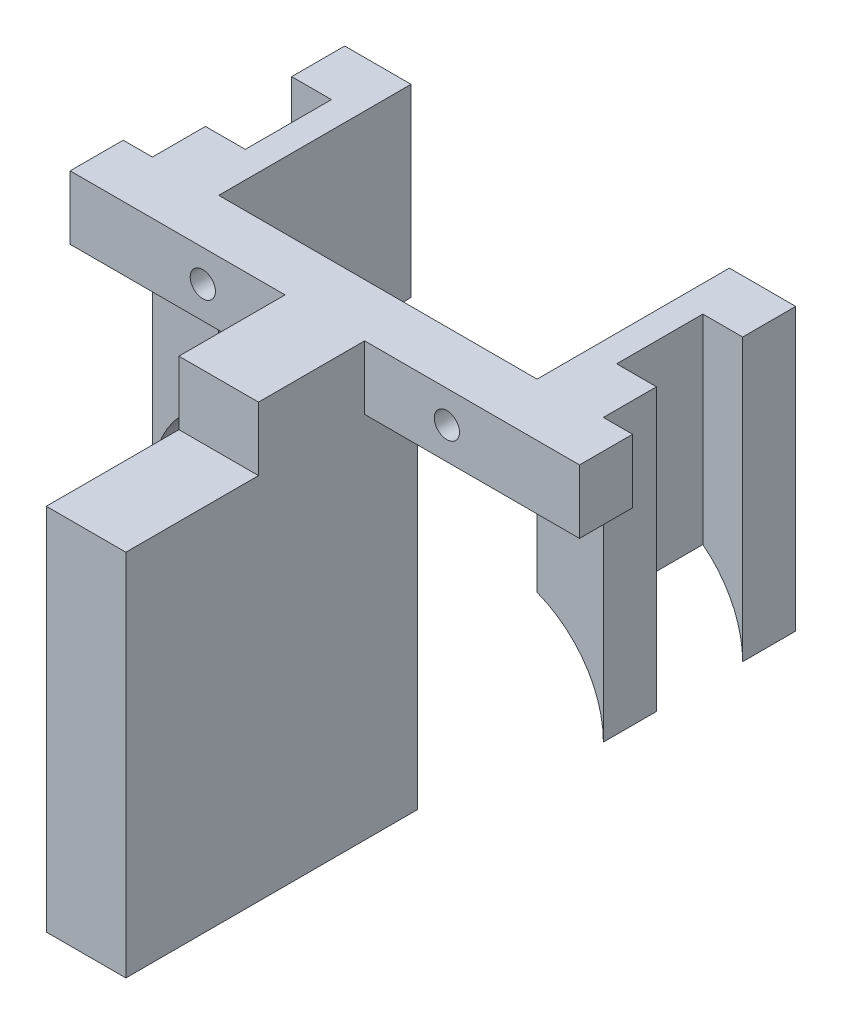
ISO-10303-21;
HEADER;
FILE_DESCRIPTION(('STEP AP214'),'2;1');
FILE_NAME('part.step','',(''),(''),'','','');
FILE_SCHEMA(('AUTOMOTIVE_DESIGN { 1 0 10303 214 1 1 1 1 }'));
ENDSEC;
DATA;
#1=APPLICATION_CONTEXT('core data for automotive mechanical design processes');
#2=APPLICATION_PROTOCOL_DEFINITION('international standard','automotive_design',2000,#1);
#3=PRODUCT_CONTEXT('',#1,'mechanical');
#4=PRODUCT('Part','Part','',(#3));
#5=PRODUCT_RELATED_PRODUCT_CATEGORY('part','',(#4));
#6=PRODUCT_DEFINITION_FORMATION('','',#4);
#7=PRODUCT_DEFINITION_CONTEXT('part definition',#1,'design');
#8=PRODUCT_DEFINITION('design','',#6,#7);
#9=PRODUCT_DEFINITION_SHAPE('','',#8);
#10=(LENGTH_UNIT() NAMED_UNIT(*) SI_UNIT(.MILLI.,.METRE.));
#11=(NAMED_UNIT(*) PLANE_ANGLE_UNIT() SI_UNIT($,.RADIAN.));
#12=(NAMED_UNIT(*) SI_UNIT($,.STERADIAN.) SOLID_ANGLE_UNIT());
#13=UNCERTAINTY_MEASURE_WITH_UNIT(LENGTH_MEASURE(1.E-05),#10,'distance_accuracy_value','');
#14=(GEOMETRIC_REPRESENTATION_CONTEXT(3) GLOBAL_UNCERTAINTY_ASSIGNED_CONTEXT((#13)) GLOBAL_UNIT_ASSIGNED_CONTEXT((#10,
#11,#12)) REPRESENTATION_CONTEXT('',''));
#15=CARTESIAN_POINT('',(0.,0.,0.));
#16=DIRECTION('',(0.,0.,1.));
#17=DIRECTION('',(1.,0.,0.));
#18=AXIS2_PLACEMENT_3D('',#15,#16,#17);
#19=CARTESIAN_POINT('',(0.,-4.8,4.));
#20=DIRECTION('',(0.,1.,0.));
#21=DIRECTION('',(0.,0.,1.));
#22=AXIS2_PLACEMENT_3D('',#19,#20,#21);
#23=PLANE('',#22);
#24=DIRECTION('',(0.,0.,-1.));
#25=VECTOR('',#24,1.);
#26=CARTESIAN_POINT('',(16.2,-4.8,0.));
#27=LINE('',#26,#25);
#28=CARTESIAN_POINT('',(16.2,-4.8,4.));
#29=VERTEX_POINT('',#28);
#30=CARTESIAN_POINT('',(16.2,-4.8,0.));
#31=VERTEX_POINT('',#30);
#32=EDGE_CURVE('E268',#29,#31,#27,.T.);
#33=ORIENTED_EDGE('',*,*,#32,.F.);
#34=DIRECTION('',(1.,0.,0.));
#35=VECTOR('',#34,1.);
#36=CARTESIAN_POINT('',(0.,-4.8,4.));
#37=LINE('',#36,#35);
#38=CARTESIAN_POINT('',(0.,-4.8,4.));
#39=VERTEX_POINT('',#38);
#40=EDGE_CURVE('E429',#39,#29,#37,.T.);
#41=ORIENTED_EDGE('',*,*,#40,.F.);
#42=DIRECTION('',(0.,0.,-1.));
#43=VECTOR('',#42,1.);
#44=CARTESIAN_POINT('',(0.,-4.8,4.));
#45=LINE('',#44,#43);
#46=CARTESIAN_POINT('',(0.,-4.8,0.));
#47=VERTEX_POINT('',#46);
#48=EDGE_CURVE('E45',#39,#47,#45,.T.);
#49=ORIENTED_EDGE('',*,*,#48,.T.);
#50=DIRECTION('',(1.,0.,0.));
#51=VECTOR('',#50,1.);
#52=CARTESIAN_POINT('',(0.,-4.8,0.));
#53=LINE('',#52,#51);
#54=CARTESIAN_POINT('',(2.2,-4.8,0.));
#55=VERTEX_POINT('',#54);
#56=EDGE_CURVE('E439',#47,#55,#53,.T.);
#57=ORIENTED_EDGE('',*,*,#56,.T.);
#58=CARTESIAN_POINT('',(7.2,-4.8,0.));
#59=VERTEX_POINT('',#58);
#60=EDGE_CURVE('E443',#55,#59,#53,.T.);
#61=ORIENTED_EDGE('',*,*,#60,.T.);
#62=EDGE_CURVE('E466',#59,#31,#53,.T.);
#63=ORIENTED_EDGE('',*,*,#62,.T.);
#64=EDGE_LOOP('',(#33,#41,#49,#57,#61,#63));
#65=FACE_BOUND('',#64,.T.);
#66=ADVANCED_FACE('F41',(#65),#23,.F.);
#67=DIRECTION('',(0.,0.,1.));
#68=VECTOR('',#67,1.);
#69=CARTESIAN_POINT('',(22.2,-4.8,0.));
#70=LINE('',#69,#68);
#71=CARTESIAN_POINT('',(22.2,-4.8,0.));
#72=VERTEX_POINT('',#71);
#73=CARTESIAN_POINT('',(22.2,-4.8,4.));
#74=VERTEX_POINT('',#73);
#75=EDGE_CURVE('E507',#72,#74,#70,.T.);
#76=ORIENTED_EDGE('',*,*,#75,.F.);
#77=CARTESIAN_POINT('',(31.2,-4.8,0.));
#78=VERTEX_POINT('',#77);
#79=EDGE_CURVE('E444',#72,#78,#53,.T.);
#80=ORIENTED_EDGE('',*,*,#79,.T.);
#81=DIRECTION('',(1.,0.,0.));
#82=VECTOR('',#81,1.);
#83=CARTESIAN_POINT('',(0.,-4.8,0.));
#84=LINE('',#83,#82);
#85=CARTESIAN_POINT('',(36.2,-4.8,0.));
#86=VERTEX_POINT('',#85);
#87=EDGE_CURVE('E362',#78,#86,#84,.T.);
#88=ORIENTED_EDGE('',*,*,#87,.T.);
#89=CARTESIAN_POINT('',(38.4,-4.8,0.));
#90=VERTEX_POINT('',#89);
#91=EDGE_CURVE('E438',#86,#90,#53,.T.);
#92=ORIENTED_EDGE('',*,*,#91,.T.);
#93=DIRECTION('',(0.,0.,-1.));
#94=VECTOR('',#93,1.);
#95=CARTESIAN_POINT('',(38.4,-4.8,4.));
#96=LINE('',#95,#94);
#97=CARTESIAN_POINT('',(38.4,-4.8,4.));
#98=VERTEX_POINT('',#97);
#99=EDGE_CURVE('E454',#98,#90,#96,.T.);
#100=ORIENTED_EDGE('',*,*,#99,.F.);
#101=EDGE_CURVE('E427',#74,#98,#37,.T.);
#102=ORIENTED_EDGE('',*,*,#101,.F.);
#103=EDGE_LOOP('',(#76,#80,#88,#92,#100,#102));
#104=FACE_BOUND('',#103,.T.);
#105=ADVANCED_FACE('F493',(#104),#23,.F.);
#106=CARTESIAN_POINT('',(0.,0.,4.));
#107=DIRECTION('',(0.,0.,1.));
#108=DIRECTION('',(1.,0.,0.));
#109=AXIS2_PLACEMENT_3D('',#106,#107,#108);
#110=PLANE('',#109);
#111=DIRECTION('',(0.,1.,0.));
#112=VECTOR('',#111,1.);
#113=CARTESIAN_POINT('',(22.2,0.,4.));
#114=LINE('',#113,#112);
#115=CARTESIAN_POINT('',(22.2,0.,4.));
#116=VERTEX_POINT('',#115);
#117=EDGE_CURVE('E269',#74,#116,#114,.T.);
#118=ORIENTED_EDGE('',*,*,#117,.F.);
#119=ORIENTED_EDGE('',*,*,#101,.T.);
#120=DIRECTION('',(0.,1.,0.));
#121=VECTOR('',#120,1.);
#122=CARTESIAN_POINT('',(38.4,0.,4.));
#123=LINE('',#122,#121);
#124=CARTESIAN_POINT('',(38.4,0.,4.));
#125=VERTEX_POINT('',#124);
#126=EDGE_CURVE('E431',#98,#125,#123,.T.);
#127=ORIENTED_EDGE('',*,*,#126,.T.);
#128=DIRECTION('',(-1.,0.,0.));
#129=VECTOR('',#128,1.);
#130=CARTESIAN_POINT('',(0.,0.,4.));
#131=LINE('',#130,#129);
#132=EDGE_CURVE('E67',#125,#116,#131,.T.);
#133=ORIENTED_EDGE('',*,*,#132,.T.);
#134=EDGE_LOOP('',(#118,#119,#127,#133));
#135=FACE_BOUND('',#134,.T.);
#136=CARTESIAN_POINT('',(28.4,-2.4,4.));
#137=DIRECTION('',(0.,0.,1.));
#138=DIRECTION('',(1.,0.,0.));
#139=AXIS2_PLACEMENT_3D('',#136,#137,#138);
#140=CIRCLE('',#139,0.950000000000001);
#141=CARTESIAN_POINT('',(29.35,-2.4,4.));
#142=VERTEX_POINT('',#141);
#143=EDGE_CURVE('E412',#142,#142,#140,.T.);
#144=ORIENTED_EDGE('',*,*,#143,.F.);
#145=EDGE_LOOP('',(#144));
#146=FACE_BOUND('',#145,.T.);
#147=ADVANCED_FACE('F508',(#135,#146),#110,.T.);
#148=CARTESIAN_POINT('',(0.,0.,0.));
#149=DIRECTION('',(0.,0.,1.));
#150=DIRECTION('',(1.,0.,0.));
#151=AXIS2_PLACEMENT_3D('',#148,#149,#150);
#152=PLANE('',#151);
#153=ORIENTED_EDGE('',*,*,#91,.F.);
#154=DIRECTION('',(0.,1.,0.));
#155=VECTOR('',#154,1.);
#156=CARTESIAN_POINT('',(36.2,-21.2,0.));
#157=LINE('',#156,#155);
#158=CARTESIAN_POINT('',(36.2,0.,0.));
#159=VERTEX_POINT('',#158);
#160=EDGE_CURVE('E320',#86,#159,#157,.T.);
#161=ORIENTED_EDGE('',*,*,#160,.T.);
#162=DIRECTION('',(-1.,0.,0.));
#163=VECTOR('',#162,1.);
#164=CARTESIAN_POINT('',(0.,0.,0.));
#165=LINE('',#164,#163);
#166=CARTESIAN_POINT('',(38.4,0.,0.));
#167=VERTEX_POINT('',#166);
#168=EDGE_CURVE('E428',#167,#159,#165,.T.);
#169=ORIENTED_EDGE('',*,*,#168,.F.);
#170=DIRECTION('',(0.,1.,0.));
#171=VECTOR('',#170,1.);
#172=CARTESIAN_POINT('',(38.4,0.,0.));
#173=LINE('',#172,#171);
#174=EDGE_CURVE('E442',#90,#167,#173,.T.);
#175=ORIENTED_EDGE('',*,*,#174,.F.);
#176=EDGE_LOOP('',(#153,#161,#169,#175));
#177=FACE_BOUND('',#176,.T.);
#178=ADVANCED_FACE('F498',(#177),#152,.F.);
#179=DIRECTION('',(0.,1.,0.));
#180=VECTOR('',#179,1.);
#181=CARTESIAN_POINT('',(2.2,-21.2,0.));
#182=LINE('',#181,#180);
#183=CARTESIAN_POINT('',(2.2,0.,0.));
#184=VERTEX_POINT('',#183);
#185=EDGE_CURVE('E11',#55,#184,#182,.T.);
#186=ORIENTED_EDGE('',*,*,#185,.F.);
#187=ORIENTED_EDGE('',*,*,#56,.F.);
#188=DIRECTION('',(0.,-1.,0.));
#189=VECTOR('',#188,1.);
#190=CARTESIAN_POINT('',(0.,0.,0.));
#191=LINE('',#190,#189);
#192=CARTESIAN_POINT('',(0.,0.,0.));
#193=VERTEX_POINT('',#192);
#194=EDGE_CURVE('E421',#193,#47,#191,.T.);
#195=ORIENTED_EDGE('',*,*,#194,.F.);
#196=EDGE_CURVE('E446',#184,#193,#165,.T.);
#197=ORIENTED_EDGE('',*,*,#196,.F.);
#198=EDGE_LOOP('',(#186,#187,#195,#197));
#199=FACE_BOUND('',#198,.T.);
#200=ADVANCED_FACE('F487',(#199),#152,.F.);
#201=DIRECTION('',(0.,-1.,0.));
#202=VECTOR('',#201,1.);
#203=CARTESIAN_POINT('',(16.2,0.,4.));
#204=LINE('',#203,#202);
#205=CARTESIAN_POINT('',(16.2,0.,4.));
#206=VERTEX_POINT('',#205);
#207=EDGE_CURVE('E59',#206,#29,#204,.T.);
#208=ORIENTED_EDGE('',*,*,#207,.F.);
#209=CARTESIAN_POINT('',(0.,0.,4.));
#210=VERTEX_POINT('',#209);
#211=EDGE_CURVE('E433',#206,#210,#131,.T.);
#212=ORIENTED_EDGE('',*,*,#211,.T.);
#213=DIRECTION('',(0.,-1.,0.));
#214=VECTOR('',#213,1.);
#215=CARTESIAN_POINT('',(0.,0.,4.));
#216=LINE('',#215,#214);
#217=EDGE_CURVE('E424',#210,#39,#216,.T.);
#218=ORIENTED_EDGE('',*,*,#217,.T.);
#219=ORIENTED_EDGE('',*,*,#40,.T.);
#220=EDGE_LOOP('',(#208,#212,#218,#219));
#221=FACE_BOUND('',#220,.T.);
#222=CARTESIAN_POINT('',(10.,-2.4,4.));
#223=DIRECTION('',(0.,0.,1.));
#224=DIRECTION('',(1.,0.,0.));
#225=AXIS2_PLACEMENT_3D('',#222,#223,#224);
#226=CIRCLE('',#225,0.949999999999999);
#227=CARTESIAN_POINT('',(10.95,-2.4,4.));
#228=VERTEX_POINT('',#227);
#229=EDGE_CURVE('E418',#228,#228,#226,.T.);
#230=ORIENTED_EDGE('',*,*,#229,.F.);
#231=EDGE_LOOP('',(#230));
#232=FACE_BOUND('',#231,.T.);
#233=ADVANCED_FACE('F571',(#221,#232),#110,.T.);
#234=CARTESIAN_POINT('',(31.2,0.,0.));
#235=VERTEX_POINT('',#234);
#236=CARTESIAN_POINT('',(7.2,0.,0.));
#237=VERTEX_POINT('',#236);
#238=EDGE_CURVE('E449',#235,#237,#165,.T.);
#239=ORIENTED_EDGE('',*,*,#238,.F.);
#240=DIRECTION('',(0.,1.,0.));
#241=VECTOR('',#240,1.);
#242=CARTESIAN_POINT('',(31.2,-21.2,0.));
#243=LINE('',#242,#241);
#244=EDGE_CURVE('E337',#78,#235,#243,.T.);
#245=ORIENTED_EDGE('',*,*,#244,.F.);
#246=ORIENTED_EDGE('',*,*,#79,.F.);
#247=DIRECTION('',(0.,1.,0.));
#248=VECTOR('',#247,1.);
#249=CARTESIAN_POINT('',(22.2,-32.6,0.));
#250=LINE('',#249,#248);
#251=CARTESIAN_POINT('',(22.2,-32.6,0.));
#252=VERTEX_POINT('',#251);
#253=EDGE_CURVE('E252',#252,#72,#250,.T.);
#254=ORIENTED_EDGE('',*,*,#253,.F.);
#255=DIRECTION('',(1.,0.,0.));
#256=VECTOR('',#255,1.);
#257=CARTESIAN_POINT('',(16.2,-32.6,0.));
#258=LINE('',#257,#256);
#259=CARTESIAN_POINT('',(16.2,-32.6,0.));
#260=VERTEX_POINT('',#259);
#261=EDGE_CURVE('E242',#260,#252,#258,.T.);
#262=ORIENTED_EDGE('',*,*,#261,.F.);
#263=DIRECTION('',(0.,1.,0.));
#264=VECTOR('',#263,1.);
#265=CARTESIAN_POINT('',(16.2,-32.6,0.));
#266=LINE('',#265,#264);
#267=EDGE_CURVE('E249',#260,#31,#266,.T.);
#268=ORIENTED_EDGE('',*,*,#267,.T.);
#269=ORIENTED_EDGE('',*,*,#62,.F.);
#270=DIRECTION('',(0.,1.,0.));
#271=VECTOR('',#270,1.);
#272=CARTESIAN_POINT('',(7.2,-21.2,0.));
#273=LINE('',#272,#271);
#274=EDGE_CURVE('E50',#59,#237,#273,.T.);
#275=ORIENTED_EDGE('',*,*,#274,.T.);
#276=EDGE_LOOP('',(#239,#245,#246,#254,#262,#268,#269,#275));
#277=FACE_BOUND('',#276,.T.);
#278=CARTESIAN_POINT('',(10.,-2.4,0.));
#279=DIRECTION('',(0.,0.,1.));
#280=DIRECTION('',(1.,0.,0.));
#281=AXIS2_PLACEMENT_3D('',#278,#279,#280);
#282=CIRCLE('',#281,0.949999999999999);
#283=CARTESIAN_POINT('',(10.95,-2.4,0.));
#284=VERTEX_POINT('',#283);
#285=EDGE_CURVE('E415',#284,#284,#282,.T.);
#286=ORIENTED_EDGE('',*,*,#285,.T.);
#287=EDGE_LOOP('',(#286));
#288=FACE_BOUND('',#287,.T.);
#289=CARTESIAN_POINT('',(28.4,-2.4,0.));
#290=DIRECTION('',(0.,0.,1.));
#291=DIRECTION('',(1.,0.,0.));
#292=AXIS2_PLACEMENT_3D('',#289,#290,#291);
#293=CIRCLE('',#292,0.950000000000001);
#294=CARTESIAN_POINT('',(29.35,-2.4,0.));
#295=VERTEX_POINT('',#294);
#296=EDGE_CURVE('E398',#295,#295,#293,.T.);
#297=ORIENTED_EDGE('',*,*,#296,.T.);
#298=EDGE_LOOP('',(#297));
#299=FACE_BOUND('',#298,.T.);
#300=ADVANCED_FACE('F245',(#277,#288,#299),#152,.F.);
#301=CARTESIAN_POINT('',(0.,0.,4.));
#302=DIRECTION('',(1.,0.,0.));
#303=DIRECTION('',(0.,0.,-1.));
#304=AXIS2_PLACEMENT_3D('',#301,#302,#303);
#305=PLANE('',#304);
#306=ORIENTED_EDGE('',*,*,#194,.T.);
#307=ORIENTED_EDGE('',*,*,#48,.F.);
#308=ORIENTED_EDGE('',*,*,#217,.F.);
#309=DIRECTION('',(0.,0.,-1.));
#310=VECTOR('',#309,1.);
#311=CARTESIAN_POINT('',(0.,0.,4.));
#312=LINE('',#311,#310);
#313=EDGE_CURVE('E435',#210,#193,#312,.T.);
#314=ORIENTED_EDGE('',*,*,#313,.T.);
#315=EDGE_LOOP('',(#306,#307,#308,#314));
#316=FACE_BOUND('',#315,.T.);
#317=ADVANCED_FACE('F43',(#316),#305,.F.);
#318=CARTESIAN_POINT('',(38.4,0.,4.));
#319=DIRECTION('',(-1.,0.,0.));
#320=DIRECTION('',(0.,0.,1.));
#321=AXIS2_PLACEMENT_3D('',#318,#319,#320);
#322=PLANE('',#321);
#323=ORIENTED_EDGE('',*,*,#174,.T.);
#324=DIRECTION('',(0.,0.,-1.));
#325=VECTOR('',#324,1.);
#326=CARTESIAN_POINT('',(38.4,0.,4.));
#327=LINE('',#326,#325);
#328=EDGE_CURVE('E452',#125,#167,#327,.T.);
#329=ORIENTED_EDGE('',*,*,#328,.F.);
#330=ORIENTED_EDGE('',*,*,#126,.F.);
#331=ORIENTED_EDGE('',*,*,#99,.T.);
#332=EDGE_LOOP('',(#323,#329,#330,#331));
#333=FACE_BOUND('',#332,.T.);
#334=ADVANCED_FACE('F501',(#333),#322,.F.);
#335=CARTESIAN_POINT('',(0.,0.,4.));
#336=DIRECTION('',(0.,-1.,0.));
#337=DIRECTION('',(1.,0.,0.));
#338=AXIS2_PLACEMENT_3D('',#335,#336,#337);
#339=PLANE('',#338);
#340=ORIENTED_EDGE('',*,*,#168,.T.);
#341=DIRECTION('',(0.,0.,-1.));
#342=VECTOR('',#341,1.);
#343=CARTESIAN_POINT('',(36.2,0.,-4.));
#344=LINE('',#343,#342);
#345=CARTESIAN_POINT('',(36.2,0.,-4.));
#346=VERTEX_POINT('',#345);
#347=EDGE_CURVE('E359',#159,#346,#344,.T.);
#348=ORIENTED_EDGE('',*,*,#347,.T.);
#349=DIRECTION('',(-1.,0.,0.));
#350=VECTOR('',#349,1.);
#351=CARTESIAN_POINT('',(33.2,0.,-4.));
#352=LINE('',#351,#350);
#353=CARTESIAN_POINT('',(33.2,0.,-4.));
#354=VERTEX_POINT('',#353);
#355=EDGE_CURVE('E356',#346,#354,#352,.T.);
#356=ORIENTED_EDGE('',*,*,#355,.T.);
#357=DIRECTION('',(0.,0.,-1.));
#358=VECTOR('',#357,1.);
#359=CARTESIAN_POINT('',(33.2,0.,-10.5));
#360=LINE('',#359,#358);
#361=CARTESIAN_POINT('',(33.2,0.,-10.5));
#362=VERTEX_POINT('',#361);
#363=EDGE_CURVE('E353',#354,#362,#360,.T.);
#364=ORIENTED_EDGE('',*,*,#363,.T.);
#365=DIRECTION('',(1.,0.,0.));
#366=VECTOR('',#365,1.);
#367=CARTESIAN_POINT('',(36.2,0.,-10.5));
#368=LINE('',#367,#366);
#369=CARTESIAN_POINT('',(36.2,0.,-10.5));
#370=VERTEX_POINT('',#369);
#371=EDGE_CURVE('E350',#362,#370,#368,.T.);
#372=ORIENTED_EDGE('',*,*,#371,.T.);
#373=DIRECTION('',(0.,0.,-1.));
#374=VECTOR('',#373,1.);
#375=CARTESIAN_POINT('',(36.2,0.,-14.5));
#376=LINE('',#375,#374);
#377=CARTESIAN_POINT('',(36.2,0.,-14.5));
#378=VERTEX_POINT('',#377);
#379=EDGE_CURVE('E347',#370,#378,#376,.T.);
#380=ORIENTED_EDGE('',*,*,#379,.T.);
#381=DIRECTION('',(-1.,0.,0.));
#382=VECTOR('',#381,1.);
#383=CARTESIAN_POINT('',(31.2,0.,-14.5));
#384=LINE('',#383,#382);
#385=CARTESIAN_POINT('',(31.2,0.,-14.5));
#386=VERTEX_POINT('',#385);
#387=EDGE_CURVE('E343',#378,#386,#384,.T.);
#388=ORIENTED_EDGE('',*,*,#387,.T.);
#389=DIRECTION('',(0.,0.,1.));
#390=VECTOR('',#389,1.);
#391=CARTESIAN_POINT('',(31.2,0.,0.));
#392=LINE('',#391,#390);
#393=EDGE_CURVE('E341',#386,#235,#392,.T.);
#394=ORIENTED_EDGE('',*,*,#393,.T.);
#395=ORIENTED_EDGE('',*,*,#238,.T.);
#396=DIRECTION('',(0.,0.,-1.));
#397=VECTOR('',#396,1.);
#398=CARTESIAN_POINT('',(7.2,0.,-14.5));
#399=LINE('',#398,#397);
#400=CARTESIAN_POINT('',(7.2,0.,-14.5));
#401=VERTEX_POINT('',#400);
#402=EDGE_CURVE('E369',#237,#401,#399,.T.);
#403=ORIENTED_EDGE('',*,*,#402,.T.);
#404=DIRECTION('',(-1.,0.,0.));
#405=VECTOR('',#404,1.);
#406=CARTESIAN_POINT('',(2.2,0.,-14.5));
#407=LINE('',#406,#405);
#408=CARTESIAN_POINT('',(2.2,0.,-14.5));
#409=VERTEX_POINT('',#408);
#410=EDGE_CURVE('E380',#401,#409,#407,.T.);
#411=ORIENTED_EDGE('',*,*,#410,.T.);
#412=DIRECTION('',(0.,0.,1.));
#413=VECTOR('',#412,1.);
#414=CARTESIAN_POINT('',(2.2,0.,-10.5));
#415=LINE('',#414,#413);
#416=CARTESIAN_POINT('',(2.2,0.,-10.5));
#417=VERTEX_POINT('',#416);
#418=EDGE_CURVE('E383',#409,#417,#415,.T.);
#419=ORIENTED_EDGE('',*,*,#418,.T.);
#420=DIRECTION('',(1.,0.,0.));
#421=VECTOR('',#420,1.);
#422=CARTESIAN_POINT('',(5.2,0.,-10.5));
#423=LINE('',#422,#421);
#424=CARTESIAN_POINT('',(5.2,0.,-10.5));
#425=VERTEX_POINT('',#424);
#426=EDGE_CURVE('E386',#417,#425,#423,.T.);
#427=ORIENTED_EDGE('',*,*,#426,.T.);
#428=DIRECTION('',(0.,0.,1.));
#429=VECTOR('',#428,1.);
#430=CARTESIAN_POINT('',(5.2,0.,-4.));
#431=LINE('',#430,#429);
#432=CARTESIAN_POINT('',(5.2,0.,-4.));
#433=VERTEX_POINT('',#432);
#434=EDGE_CURVE('E389',#425,#433,#431,.T.);
#435=ORIENTED_EDGE('',*,*,#434,.T.);
#436=DIRECTION('',(-1.,0.,0.));
#437=VECTOR('',#436,1.);
#438=CARTESIAN_POINT('',(2.2,0.,-4.));
#439=LINE('',#438,#437);
#440=CARTESIAN_POINT('',(2.2,0.,-4.));
#441=VERTEX_POINT('',#440);
#442=EDGE_CURVE('E392',#433,#441,#439,.T.);
#443=ORIENTED_EDGE('',*,*,#442,.T.);
#444=DIRECTION('',(0.,0.,1.));
#445=VECTOR('',#444,1.);
#446=CARTESIAN_POINT('',(2.2,0.,0.));
#447=LINE('',#446,#445);
#448=EDGE_CURVE('E374',#441,#184,#447,.T.);
#449=ORIENTED_EDGE('',*,*,#448,.T.);
#450=ORIENTED_EDGE('',*,*,#196,.T.);
#451=ORIENTED_EDGE('',*,*,#313,.F.);
#452=ORIENTED_EDGE('',*,*,#211,.F.);
#453=DIRECTION('',(0.,0.,-1.));
#454=VECTOR('',#453,1.);
#455=CARTESIAN_POINT('',(16.2,0.,12.));
#456=LINE('',#455,#454);
#457=CARTESIAN_POINT('',(16.2,0.,12.));
#458=VERTEX_POINT('',#457);
#459=EDGE_CURVE('E287',#458,#206,#456,.T.);
#460=ORIENTED_EDGE('',*,*,#459,.F.);
#461=DIRECTION('',(-1.,0.,0.));
#462=VECTOR('',#461,1.);
#463=CARTESIAN_POINT('',(16.2,0.,12.));
#464=LINE('',#463,#462);
#465=CARTESIAN_POINT('',(22.2,0.,12.));
#466=VERTEX_POINT('',#465);
#467=EDGE_CURVE('E280',#466,#458,#464,.T.);
#468=ORIENTED_EDGE('',*,*,#467,.F.);
#469=DIRECTION('',(0.,0.,-1.));
#470=VECTOR('',#469,1.);
#471=CARTESIAN_POINT('',(22.2,0.,12.));
#472=LINE('',#471,#470);
#473=EDGE_CURVE('E292',#466,#116,#472,.T.);
#474=ORIENTED_EDGE('',*,*,#473,.T.);
#475=ORIENTED_EDGE('',*,*,#132,.F.);
#476=ORIENTED_EDGE('',*,*,#328,.T.);
#477=EDGE_LOOP('',(#340,#348,#356,#364,#372,#380,#388,#394,#395,#403,#411,#419,#427,#435,#443,
#449,#450,#451,#452,#460,#468,#474,#475,#476));
#478=FACE_BOUND('',#477,.T.);
#479=ADVANCED_FACE('F476',(#478),#339,.F.);
#480=CARTESIAN_POINT('',(10.,-2.4,4.));
#481=DIRECTION('',(0.,0.,-1.));
#482=DIRECTION('',(-1.,0.,0.));
#483=AXIS2_PLACEMENT_3D('',#480,#481,#482);
#484=CYLINDRICAL_SURFACE('',#483,0.949999999999999);
#485=ORIENTED_EDGE('',*,*,#229,.T.);
#486=EDGE_LOOP('',(#485));
#487=FACE_BOUND('',#486,.T.);
#488=ORIENTED_EDGE('',*,*,#285,.F.);
#489=EDGE_LOOP('',(#488));
#490=FACE_BOUND('',#489,.T.);
#491=ADVANCED_FACE('F568',(#487,#490),#484,.F.);
#492=CARTESIAN_POINT('',(28.4,-2.4,4.));
#493=DIRECTION('',(0.,0.,-1.));
#494=DIRECTION('',(-1.,0.,0.));
#495=AXIS2_PLACEMENT_3D('',#492,#493,#494);
#496=CYLINDRICAL_SURFACE('',#495,0.950000000000001);
#497=ORIENTED_EDGE('',*,*,#143,.T.);
#498=EDGE_LOOP('',(#497));
#499=FACE_BOUND('',#498,.T.);
#500=ORIENTED_EDGE('',*,*,#296,.F.);
#501=EDGE_LOOP('',(#500));
#502=FACE_BOUND('',#501,.T.);
#503=ADVANCED_FACE('F576',(#499,#502),#496,.F.);
#504=CARTESIAN_POINT('',(7.2,-21.2,0.));
#505=DIRECTION('',(0.,0.,1.));
#506=DIRECTION('',(1.,0.,0.));
#507=AXIS2_PLACEMENT_3D('',#504,#505,#506);
#508=PLANE('',#507);
#509=CARTESIAN_POINT('',(10.,-21.2,0.));
#510=DIRECTION('',(0.,0.,-1.));
#511=DIRECTION('',(-1.,0.,0.));
#512=AXIS2_PLACEMENT_3D('',#509,#510,#511);
#513=CIRCLE('',#512,7.8);
#514=CARTESIAN_POINT('',(2.2,-21.2,0.));
#515=VERTEX_POINT('',#514);
#516=CARTESIAN_POINT('',(7.2,-13.9198901107195,0.));
#517=VERTEX_POINT('',#516);
#518=EDGE_CURVE('E295',#515,#517,#513,.T.);
#519=ORIENTED_EDGE('',*,*,#518,.T.);
#520=EDGE_CURVE('E377',#517,#59,#273,.T.);
#521=ORIENTED_EDGE('',*,*,#520,.T.);
#522=ORIENTED_EDGE('',*,*,#60,.F.);
#523=EDGE_CURVE('E52',#515,#55,#182,.T.);
#524=ORIENTED_EDGE('',*,*,#523,.F.);
#525=EDGE_LOOP('',(#519,#521,#522,#524));
#526=FACE_BOUND('',#525,.T.);
#527=ADVANCED_FACE('F580',(#526),#508,.T.);
#528=CARTESIAN_POINT('',(2.2,-21.2,0.));
#529=DIRECTION('',(-1.,0.,0.));
#530=DIRECTION('',(0.,0.,1.));
#531=AXIS2_PLACEMENT_3D('',#528,#529,#530);
#532=PLANE('',#531);
#533=ORIENTED_EDGE('',*,*,#448,.F.);
#534=DIRECTION('',(0.,1.,0.));
#535=VECTOR('',#534,1.);
#536=CARTESIAN_POINT('',(2.2,-21.2,-4.));
#537=LINE('',#536,#535);
#538=CARTESIAN_POINT('',(2.2,-21.2,-4.));
#539=VERTEX_POINT('',#538);
#540=EDGE_CURVE('E399',#539,#441,#537,.T.);
#541=ORIENTED_EDGE('',*,*,#540,.F.);
#542=DIRECTION('',(0.,0.,1.));
#543=VECTOR('',#542,1.);
#544=CARTESIAN_POINT('',(2.2,-21.2,0.));
#545=LINE('',#544,#543);
#546=EDGE_CURVE('E373',#539,#515,#545,.T.);
#547=ORIENTED_EDGE('',*,*,#546,.T.);
#548=ORIENTED_EDGE('',*,*,#523,.T.);
#549=ORIENTED_EDGE('',*,*,#185,.T.);
#550=EDGE_LOOP('',(#533,#541,#547,#548,#549));
#551=FACE_BOUND('',#550,.T.);
#552=ADVANCED_FACE('F584',(#551),#532,.T.);
#553=CARTESIAN_POINT('',(2.2,-21.2,-4.));
#554=DIRECTION('',(0.,0.,-1.));
#555=DIRECTION('',(-1.,0.,0.));
#556=AXIS2_PLACEMENT_3D('',#553,#554,#555);
#557=PLANE('',#556);
#558=CARTESIAN_POINT('',(10.,-21.2,-4.));
#559=DIRECTION('',(0.,0.,-1.));
#560=DIRECTION('',(-1.,0.,0.));
#561=AXIS2_PLACEMENT_3D('',#558,#559,#560);
#562=CIRCLE('',#561,7.8);
#563=CARTESIAN_POINT('',(5.2,-15.0518295404242,-4.));
#564=VERTEX_POINT('',#563);
#565=EDGE_CURVE('E316',#539,#564,#562,.T.);
#566=ORIENTED_EDGE('',*,*,#565,.F.);
#567=ORIENTED_EDGE('',*,*,#540,.T.);
#568=ORIENTED_EDGE('',*,*,#442,.F.);
#569=DIRECTION('',(0.,1.,0.));
#570=VECTOR('',#569,1.);
#571=CARTESIAN_POINT('',(5.2,-21.2,-4.));
#572=LINE('',#571,#570);
#573=EDGE_CURVE('E401',#564,#433,#572,.T.);
#574=ORIENTED_EDGE('',*,*,#573,.F.);
#575=EDGE_LOOP('',(#566,#567,#568,#574));
#576=FACE_BOUND('',#575,.T.);
#577=ADVANCED_FACE('F602',(#576),#557,.T.);
#578=CARTESIAN_POINT('',(5.2,-21.2,-4.));
#579=DIRECTION('',(-1.,0.,0.));
#580=DIRECTION('',(0.,0.,1.));
#581=AXIS2_PLACEMENT_3D('',#578,#579,#580);
#582=PLANE('',#581);
#583=DIRECTION('',(0.,0.,-1.));
#584=VECTOR('',#583,1.);
#585=CARTESIAN_POINT('',(5.2,-15.0518295404242,0.));
#586=LINE('',#585,#584);
#587=CARTESIAN_POINT('',(5.2,-15.0518295404242,-10.5));
#588=VERTEX_POINT('',#587);
#589=EDGE_CURVE('E314',#564,#588,#586,.T.);
#590=ORIENTED_EDGE('',*,*,#589,.F.);
#591=ORIENTED_EDGE('',*,*,#573,.T.);
#592=ORIENTED_EDGE('',*,*,#434,.F.);
#593=DIRECTION('',(0.,1.,0.));
#594=VECTOR('',#593,1.);
#595=CARTESIAN_POINT('',(5.2,-21.2,-10.5));
#596=LINE('',#595,#594);
#597=EDGE_CURVE('E403',#588,#425,#596,.T.);
#598=ORIENTED_EDGE('',*,*,#597,.F.);
#599=EDGE_LOOP('',(#590,#591,#592,#598));
#600=FACE_BOUND('',#599,.T.);
#601=ADVANCED_FACE('F598',(#600),#582,.T.);
#602=CARTESIAN_POINT('',(5.2,-21.2,-10.5));
#603=DIRECTION('',(0.,0.,1.));
#604=DIRECTION('',(1.,0.,0.));
#605=AXIS2_PLACEMENT_3D('',#602,#603,#604);
#606=PLANE('',#605);
#607=CARTESIAN_POINT('',(10.,-21.2,-10.5));
#608=DIRECTION('',(0.,0.,1.));
#609=DIRECTION('',(1.,0.,0.));
#610=AXIS2_PLACEMENT_3D('',#607,#608,#609);
#611=CIRCLE('',#610,7.8);
#612=CARTESIAN_POINT('',(2.2,-21.2,-10.5));
#613=VERTEX_POINT('',#612);
#614=EDGE_CURVE('E312',#588,#613,#611,.T.);
#615=ORIENTED_EDGE('',*,*,#614,.F.);
#616=ORIENTED_EDGE('',*,*,#597,.T.);
#617=ORIENTED_EDGE('',*,*,#426,.F.);
#618=DIRECTION('',(0.,1.,0.));
#619=VECTOR('',#618,1.);
#620=CARTESIAN_POINT('',(2.2,-21.2,-10.5));
#621=LINE('',#620,#619);
#622=EDGE_CURVE('E405',#613,#417,#621,.T.);
#623=ORIENTED_EDGE('',*,*,#622,.F.);
#624=EDGE_LOOP('',(#615,#616,#617,#623));
#625=FACE_BOUND('',#624,.T.);
#626=ADVANCED_FACE('F594',(#625),#606,.T.);
#627=CARTESIAN_POINT('',(2.2,-21.2,-10.5));
#628=DIRECTION('',(-1.,0.,0.));
#629=DIRECTION('',(0.,0.,1.));
#630=AXIS2_PLACEMENT_3D('',#627,#628,#629);
#631=PLANE('',#630);
#632=ORIENTED_EDGE('',*,*,#418,.F.);
#633=DIRECTION('',(0.,1.,0.));
#634=VECTOR('',#633,1.);
#635=CARTESIAN_POINT('',(2.2,-21.2,-14.5));
#636=LINE('',#635,#634);
#637=CARTESIAN_POINT('',(2.2,-21.2,-14.5));
#638=VERTEX_POINT('',#637);
#639=EDGE_CURVE('E407',#638,#409,#636,.T.);
#640=ORIENTED_EDGE('',*,*,#639,.F.);
#641=DIRECTION('',(0.,0.,1.));
#642=VECTOR('',#641,1.);
#643=CARTESIAN_POINT('',(2.2,-21.2,-10.5));
#644=LINE('',#643,#642);
#645=EDGE_CURVE('E370',#638,#613,#644,.T.);
#646=ORIENTED_EDGE('',*,*,#645,.T.);
#647=ORIENTED_EDGE('',*,*,#622,.T.);
#648=EDGE_LOOP('',(#632,#640,#646,#647));
#649=FACE_BOUND('',#648,.T.);
#650=ADVANCED_FACE('F590',(#649),#631,.T.);
#651=CARTESIAN_POINT('',(2.2,-21.2,-14.5));
#652=DIRECTION('',(0.,0.,-1.));
#653=DIRECTION('',(-1.,0.,0.));
#654=AXIS2_PLACEMENT_3D('',#651,#652,#653);
#655=PLANE('',#654);
#656=CARTESIAN_POINT('',(10.,-21.2,-14.5));
#657=DIRECTION('',(0.,0.,-1.));
#658=DIRECTION('',(-1.,0.,0.));
#659=AXIS2_PLACEMENT_3D('',#656,#657,#658);
#660=CIRCLE('',#659,7.8);
#661=CARTESIAN_POINT('',(7.2,-13.9198901107195,-14.5));
#662=VERTEX_POINT('',#661);
#663=EDGE_CURVE('E299',#638,#662,#660,.T.);
#664=ORIENTED_EDGE('',*,*,#663,.F.);
#665=ORIENTED_EDGE('',*,*,#639,.T.);
#666=ORIENTED_EDGE('',*,*,#410,.F.);
#667=DIRECTION('',(0.,1.,0.));
#668=VECTOR('',#667,1.);
#669=CARTESIAN_POINT('',(7.2,-21.2,-14.5));
#670=LINE('',#669,#668);
#671=EDGE_CURVE('E409',#662,#401,#670,.T.);
#672=ORIENTED_EDGE('',*,*,#671,.F.);
#673=EDGE_LOOP('',(#664,#665,#666,#672));
#674=FACE_BOUND('',#673,.T.);
#675=ADVANCED_FACE('F587',(#674),#655,.T.);
#676=CARTESIAN_POINT('',(7.2,-21.2,-14.5));
#677=DIRECTION('',(1.,0.,0.));
#678=DIRECTION('',(0.,0.,-1.));
#679=AXIS2_PLACEMENT_3D('',#676,#677,#678);
#680=PLANE('',#679);
#681=DIRECTION('',(0.,0.,-1.));
#682=VECTOR('',#681,1.);
#683=CARTESIAN_POINT('',(7.2,-13.9198901107195,0.));
#684=LINE('',#683,#682);
#685=EDGE_CURVE('E318',#662,#517,#684,.F.);
#686=ORIENTED_EDGE('',*,*,#685,.F.);
#687=ORIENTED_EDGE('',*,*,#671,.T.);
#688=ORIENTED_EDGE('',*,*,#402,.F.);
#689=ORIENTED_EDGE('',*,*,#274,.F.);
#690=ORIENTED_EDGE('',*,*,#520,.F.);
#691=EDGE_LOOP('',(#686,#687,#688,#689,#690));
#692=FACE_BOUND('',#691,.T.);
#693=ADVANCED_FACE('F472',(#692),#680,.T.);
#694=CARTESIAN_POINT('',(36.2,-21.2,0.));
#695=DIRECTION('',(0.,0.,1.));
#696=DIRECTION('',(1.,0.,0.));
#697=AXIS2_PLACEMENT_3D('',#694,#695,#696);
#698=PLANE('',#697);
#699=CARTESIAN_POINT('',(28.4000000000024,-21.1999999999966,0.));
#700=DIRECTION('',(0.,0.,-1.));
#701=DIRECTION('',(-1.,0.,0.));
#702=AXIS2_PLACEMENT_3D('',#699,#700,#701);
#703=CIRCLE('',#702,7.80000000000002);
#704=CARTESIAN_POINT('',(31.2,-13.9198901107151,0.));
#705=VERTEX_POINT('',#704);
#706=CARTESIAN_POINT('',(36.2000000000024,-21.2,0.));
#707=VERTEX_POINT('',#706);
#708=EDGE_CURVE('E294',#705,#707,#703,.T.);
#709=ORIENTED_EDGE('',*,*,#708,.T.);
#710=EDGE_CURVE('E338',#707,#86,#157,.T.);
#711=ORIENTED_EDGE('',*,*,#710,.T.);
#712=ORIENTED_EDGE('',*,*,#87,.F.);
#713=EDGE_CURVE('E334',#705,#78,#243,.T.);
#714=ORIENTED_EDGE('',*,*,#713,.F.);
#715=EDGE_LOOP('',(#709,#711,#712,#714));
#716=FACE_BOUND('',#715,.T.);
#717=ADVANCED_FACE('F518',(#716),#698,.T.);
#718=CARTESIAN_POINT('',(36.2,-21.2,-4.));
#719=DIRECTION('',(1.,0.,0.));
#720=DIRECTION('',(0.,0.,-1.));
#721=AXIS2_PLACEMENT_3D('',#718,#719,#720);
#722=PLANE('',#721);
#723=ORIENTED_EDGE('',*,*,#347,.F.);
#724=ORIENTED_EDGE('',*,*,#160,.F.);
#725=ORIENTED_EDGE('',*,*,#710,.F.);
#726=DIRECTION('',(0.,0.,-1.));
#727=VECTOR('',#726,1.);
#728=CARTESIAN_POINT('',(36.2,-21.2,-4.));
#729=LINE('',#728,#727);
#730=CARTESIAN_POINT('',(36.2,-21.2,-4.));
#731=VERTEX_POINT('',#730);
#732=EDGE_CURVE('E344',#707,#731,#729,.T.);
#733=ORIENTED_EDGE('',*,*,#732,.T.);
#734=DIRECTION('',(0.,1.,0.));
#735=VECTOR('',#734,1.);
#736=CARTESIAN_POINT('',(36.2,-21.2,-4.));
#737=LINE('',#736,#735);
#738=EDGE_CURVE('E321',#731,#346,#737,.T.);
#739=ORIENTED_EDGE('',*,*,#738,.T.);
#740=EDGE_LOOP('',(#723,#724,#725,#733,#739));
#741=FACE_BOUND('',#740,.T.);
#742=ADVANCED_FACE('F521',(#741),#722,.T.);
#743=CARTESIAN_POINT('',(31.2,-21.2,0.));
#744=DIRECTION('',(-1.,0.,0.));
#745=DIRECTION('',(0.,0.,1.));
#746=AXIS2_PLACEMENT_3D('',#743,#744,#745);
#747=PLANE('',#746);
#748=DIRECTION('',(0.,0.,-1.));
#749=VECTOR('',#748,1.);
#750=CARTESIAN_POINT('',(31.2,-13.9198901107151,0.));
#751=LINE('',#750,#749);
#752=CARTESIAN_POINT('',(31.2,-13.9198901107151,-14.5));
#753=VERTEX_POINT('',#752);
#754=EDGE_CURVE('E310',#705,#753,#751,.T.);
#755=ORIENTED_EDGE('',*,*,#754,.F.);
#756=ORIENTED_EDGE('',*,*,#713,.T.);
#757=ORIENTED_EDGE('',*,*,#244,.T.);
#758=ORIENTED_EDGE('',*,*,#393,.F.);
#759=DIRECTION('',(0.,1.,0.));
#760=VECTOR('',#759,1.);
#761=CARTESIAN_POINT('',(31.2,-21.2,-14.5));
#762=LINE('',#761,#760);
#763=EDGE_CURVE('E332',#753,#386,#762,.T.);
#764=ORIENTED_EDGE('',*,*,#763,.F.);
#765=EDGE_LOOP('',(#755,#756,#757,#758,#764));
#766=FACE_BOUND('',#765,.T.);
#767=ADVANCED_FACE('F514',(#766),#747,.T.);
#768=CARTESIAN_POINT('',(31.2,-21.2,-14.5));
#769=DIRECTION('',(0.,0.,-1.));
#770=DIRECTION('',(-1.,0.,0.));
#771=AXIS2_PLACEMENT_3D('',#768,#769,#770);
#772=PLANE('',#771);
#773=CARTESIAN_POINT('',(28.4000000000024,-21.1999999999966,-14.5));
#774=DIRECTION('',(0.,0.,-1.));
#775=DIRECTION('',(-1.,0.,0.));
#776=AXIS2_PLACEMENT_3D('',#773,#774,#775);
#777=CIRCLE('',#776,7.80000000000002);
#778=CARTESIAN_POINT('',(36.2000000000024,-21.2,-14.5));
#779=VERTEX_POINT('',#778);
#780=EDGE_CURVE('E301',#753,#779,#777,.T.);
#781=ORIENTED_EDGE('',*,*,#780,.F.);
#782=ORIENTED_EDGE('',*,*,#763,.T.);
#783=ORIENTED_EDGE('',*,*,#387,.F.);
#784=DIRECTION('',(0.,1.,0.));
#785=VECTOR('',#784,1.);
#786=CARTESIAN_POINT('',(36.2,-21.2,-14.5));
#787=LINE('',#786,#785);
#788=EDGE_CURVE('E330',#779,#378,#787,.T.);
#789=ORIENTED_EDGE('',*,*,#788,.F.);
#790=EDGE_LOOP('',(#781,#782,#783,#789));
#791=FACE_BOUND('',#790,.T.);
#792=ADVANCED_FACE('F545',(#791),#772,.T.);
#793=CARTESIAN_POINT('',(36.2,-21.2,-14.5));
#794=DIRECTION('',(1.,0.,0.));
#795=DIRECTION('',(0.,0.,-1.));
#796=AXIS2_PLACEMENT_3D('',#793,#794,#795);
#797=PLANE('',#796);
#798=ORIENTED_EDGE('',*,*,#379,.F.);
#799=DIRECTION('',(0.,1.,0.));
#800=VECTOR('',#799,1.);
#801=CARTESIAN_POINT('',(36.2,-21.2,-10.5));
#802=LINE('',#801,#800);
#803=CARTESIAN_POINT('',(36.2000000000024,-21.2,-10.5));
#804=VERTEX_POINT('',#803);
#805=EDGE_CURVE('E328',#804,#370,#802,.T.);
#806=ORIENTED_EDGE('',*,*,#805,.F.);
#807=DIRECTION('',(0.,0.,-1.));
#808=VECTOR('',#807,1.);
#809=CARTESIAN_POINT('',(36.2,-21.2,-14.5));
#810=LINE('',#809,#808);
#811=EDGE_CURVE('E323',#804,#779,#810,.T.);
#812=ORIENTED_EDGE('',*,*,#811,.T.);
#813=ORIENTED_EDGE('',*,*,#788,.T.);
#814=EDGE_LOOP('',(#798,#806,#812,#813));
#815=FACE_BOUND('',#814,.T.);
#816=ADVANCED_FACE('F541',(#815),#797,.T.);
#817=CARTESIAN_POINT('',(36.2,-21.2,-10.5));
#818=DIRECTION('',(0.,0.,1.));
#819=DIRECTION('',(1.,0.,0.));
#820=AXIS2_PLACEMENT_3D('',#817,#818,#819);
#821=PLANE('',#820);
#822=CARTESIAN_POINT('',(28.4000000000024,-21.1999999999966,-10.5));
#823=DIRECTION('',(0.,0.,1.));
#824=DIRECTION('',(1.,0.,0.));
#825=AXIS2_PLACEMENT_3D('',#822,#823,#824);
#826=CIRCLE('',#825,7.80000000000002);
#827=CARTESIAN_POINT('',(33.2,-15.0518295404189,-10.5));
#828=VERTEX_POINT('',#827);
#829=EDGE_CURVE('E308',#804,#828,#826,.T.);
#830=ORIENTED_EDGE('',*,*,#829,.F.);
#831=ORIENTED_EDGE('',*,*,#805,.T.);
#832=ORIENTED_EDGE('',*,*,#371,.F.);
#833=DIRECTION('',(0.,1.,0.));
#834=VECTOR('',#833,1.);
#835=CARTESIAN_POINT('',(33.2,-21.2,-10.5));
#836=LINE('',#835,#834);
#837=EDGE_CURVE('E326',#828,#362,#836,.T.);
#838=ORIENTED_EDGE('',*,*,#837,.F.);
#839=EDGE_LOOP('',(#830,#831,#832,#838));
#840=FACE_BOUND('',#839,.T.);
#841=ADVANCED_FACE('F536',(#840),#821,.T.);
#842=CARTESIAN_POINT('',(33.2,-21.2,-10.5));
#843=DIRECTION('',(1.,0.,0.));
#844=DIRECTION('',(0.,0.,-1.));
#845=AXIS2_PLACEMENT_3D('',#842,#843,#844);
#846=PLANE('',#845);
#847=DIRECTION('',(0.,0.,-1.));
#848=VECTOR('',#847,1.);
#849=CARTESIAN_POINT('',(33.2,-15.0518295404189,0.));
#850=LINE('',#849,#848);
#851=CARTESIAN_POINT('',(33.2,-15.0518295404189,-4.));
#852=VERTEX_POINT('',#851);
#853=EDGE_CURVE('E306',#828,#852,#850,.F.);
#854=ORIENTED_EDGE('',*,*,#853,.F.);
#855=ORIENTED_EDGE('',*,*,#837,.T.);
#856=ORIENTED_EDGE('',*,*,#363,.F.);
#857=DIRECTION('',(0.,1.,0.));
#858=VECTOR('',#857,1.);
#859=CARTESIAN_POINT('',(33.2,-21.2,-4.));
#860=LINE('',#859,#858);
#861=EDGE_CURVE('E324',#852,#354,#860,.T.);
#862=ORIENTED_EDGE('',*,*,#861,.F.);
#863=EDGE_LOOP('',(#854,#855,#856,#862));
#864=FACE_BOUND('',#863,.T.);
#865=ADVANCED_FACE('F531',(#864),#846,.T.);
#866=CARTESIAN_POINT('',(33.2,-21.2,-4.));
#867=DIRECTION('',(0.,0.,-1.));
#868=DIRECTION('',(-1.,0.,0.));
#869=AXIS2_PLACEMENT_3D('',#866,#867,#868);
#870=PLANE('',#869);
#871=CARTESIAN_POINT('',(28.4000000000024,-21.1999999999966,-4.));
#872=DIRECTION('',(0.,0.,-1.));
#873=DIRECTION('',(-1.,0.,0.));
#874=AXIS2_PLACEMENT_3D('',#871,#872,#873);
#875=CIRCLE('',#874,7.80000000000002);
#876=EDGE_CURVE('E298',#852,#731,#875,.T.);
#877=ORIENTED_EDGE('',*,*,#876,.F.);
#878=ORIENTED_EDGE('',*,*,#861,.T.);
#879=ORIENTED_EDGE('',*,*,#355,.F.);
#880=ORIENTED_EDGE('',*,*,#738,.F.);
#881=EDGE_LOOP('',(#877,#878,#879,#880));
#882=FACE_BOUND('',#881,.T.);
#883=ADVANCED_FACE('F527',(#882),#870,.T.);
#884=CARTESIAN_POINT('',(28.4000000000024,-21.1999999999966,0.));
#885=DIRECTION('',(0.,0.,-1.));
#886=DIRECTION('',(-1.,0.,0.));
#887=AXIS2_PLACEMENT_3D('',#884,#885,#886);
#888=CYLINDRICAL_SURFACE('',#887,7.80000000000002);
#889=ORIENTED_EDGE('',*,*,#754,.T.);
#890=ORIENTED_EDGE('',*,*,#780,.T.);
#891=ORIENTED_EDGE('',*,*,#811,.F.);
#892=ORIENTED_EDGE('',*,*,#829,.T.);
#893=ORIENTED_EDGE('',*,*,#853,.T.);
#894=ORIENTED_EDGE('',*,*,#876,.T.);
#895=ORIENTED_EDGE('',*,*,#732,.F.);
#896=ORIENTED_EDGE('',*,*,#708,.F.);
#897=EDGE_LOOP('',(#889,#890,#891,#892,#893,#894,#895,#896));
#898=FACE_BOUND('',#897,.T.);
#899=ADVANCED_FACE('F547',(#898),#888,.F.);
#900=CARTESIAN_POINT('',(10.,-21.2,0.));
#901=DIRECTION('',(0.,0.,-1.));
#902=DIRECTION('',(-1.,0.,0.));
#903=AXIS2_PLACEMENT_3D('',#900,#901,#902);
#904=CYLINDRICAL_SURFACE('',#903,7.8);
#905=ORIENTED_EDGE('',*,*,#685,.T.);
#906=ORIENTED_EDGE('',*,*,#518,.F.);
#907=ORIENTED_EDGE('',*,*,#546,.F.);
#908=ORIENTED_EDGE('',*,*,#565,.T.);
#909=ORIENTED_EDGE('',*,*,#589,.T.);
#910=ORIENTED_EDGE('',*,*,#614,.T.);
#911=ORIENTED_EDGE('',*,*,#645,.F.);
#912=ORIENTED_EDGE('',*,*,#663,.T.);
#913=EDGE_LOOP('',(#905,#906,#907,#908,#909,#910,#911,#912));
#914=FACE_BOUND('',#913,.T.);
#915=ADVANCED_FACE('F549',(#914),#904,.F.);
#916=CARTESIAN_POINT('',(22.2,0.,12.));
#917=DIRECTION('',(-1.,0.,0.));
#918=DIRECTION('',(0.,0.,1.));
#919=AXIS2_PLACEMENT_3D('',#916,#917,#918);
#920=PLANE('',#919);
#921=ORIENTED_EDGE('',*,*,#117,.T.);
#922=ORIENTED_EDGE('',*,*,#473,.F.);
#923=DIRECTION('',(0.,1.,0.));
#924=VECTOR('',#923,1.);
#925=CARTESIAN_POINT('',(22.2,0.,12.));
#926=LINE('',#925,#924);
#927=CARTESIAN_POINT('',(22.2,-4.8,12.));
#928=VERTEX_POINT('',#927);
#929=EDGE_CURVE('E277',#928,#466,#926,.T.);
#930=ORIENTED_EDGE('',*,*,#929,.F.);
#931=CARTESIAN_POINT('',(22.2,-4.8,22.));
#932=VERTEX_POINT('',#931);
#933=EDGE_CURVE('E510',#928,#932,#70,.T.);
#934=ORIENTED_EDGE('',*,*,#933,.T.);
#935=DIRECTION('',(0.,1.,0.));
#936=VECTOR('',#935,1.);
#937=CARTESIAN_POINT('',(22.2,-32.6,22.));
#938=LINE('',#937,#936);
#939=CARTESIAN_POINT('',(22.2,-32.6,22.));
#940=VERTEX_POINT('',#939);
#941=EDGE_CURVE('E273',#940,#932,#938,.T.);
#942=ORIENTED_EDGE('',*,*,#941,.F.);
#943=DIRECTION('',(0.,0.,1.));
#944=VECTOR('',#943,1.);
#945=CARTESIAN_POINT('',(22.2,-32.6,0.));
#946=LINE('',#945,#944);
#947=EDGE_CURVE('E255',#252,#940,#946,.T.);
#948=ORIENTED_EDGE('',*,*,#947,.F.);
#949=ORIENTED_EDGE('',*,*,#253,.T.);
#950=ORIENTED_EDGE('',*,*,#75,.T.);
#951=EDGE_LOOP('',(#921,#922,#930,#934,#942,#948,#949,#950));
#952=FACE_BOUND('',#951,.T.);
#953=ADVANCED_FACE('F506',(#952),#920,.F.);
#954=CARTESIAN_POINT('',(16.2,0.,12.));
#955=DIRECTION('',(1.,0.,0.));
#956=DIRECTION('',(0.,0.,-1.));
#957=AXIS2_PLACEMENT_3D('',#954,#955,#956);
#958=PLANE('',#957);
#959=ORIENTED_EDGE('',*,*,#207,.T.);
#960=ORIENTED_EDGE('',*,*,#32,.T.);
#961=ORIENTED_EDGE('',*,*,#267,.F.);
#962=DIRECTION('',(0.,0.,-1.));
#963=VECTOR('',#962,1.);
#964=CARTESIAN_POINT('',(16.2,-32.6,0.));
#965=LINE('',#964,#963);
#966=CARTESIAN_POINT('',(16.2,-32.6,22.));
#967=VERTEX_POINT('',#966);
#968=EDGE_CURVE('E256',#967,#260,#965,.T.);
#969=ORIENTED_EDGE('',*,*,#968,.F.);
#970=DIRECTION('',(0.,1.,0.));
#971=VECTOR('',#970,1.);
#972=CARTESIAN_POINT('',(16.2,-32.6,22.));
#973=LINE('',#972,#971);
#974=CARTESIAN_POINT('',(16.2,-4.8,22.));
#975=VERTEX_POINT('',#974);
#976=EDGE_CURVE('E887',#967,#975,#973,.T.);
#977=ORIENTED_EDGE('',*,*,#976,.T.);
#978=CARTESIAN_POINT('',(16.2,-4.8,12.));
#979=VERTEX_POINT('',#978);
#980=EDGE_CURVE('E885',#975,#979,#27,.T.);
#981=ORIENTED_EDGE('',*,*,#980,.T.);
#982=DIRECTION('',(0.,-1.,0.));
#983=VECTOR('',#982,1.);
#984=CARTESIAN_POINT('',(16.2,0.,12.));
#985=LINE('',#984,#983);
#986=EDGE_CURVE('E282',#458,#979,#985,.T.);
#987=ORIENTED_EDGE('',*,*,#986,.F.);
#988=ORIENTED_EDGE('',*,*,#459,.T.);
#989=EDGE_LOOP('',(#959,#960,#961,#969,#977,#981,#987,#988));
#990=FACE_BOUND('',#989,.T.);
#991=ADVANCED_FACE('F267',(#990),#958,.F.);
#992=CARTESIAN_POINT('',(0.,0.,12.));
#993=DIRECTION('',(0.,0.,1.));
#994=DIRECTION('',(1.,0.,0.));
#995=AXIS2_PLACEMENT_3D('',#992,#993,#994);
#996=PLANE('',#995);
#997=ORIENTED_EDGE('',*,*,#929,.T.);
#998=ORIENTED_EDGE('',*,*,#467,.T.);
#999=ORIENTED_EDGE('',*,*,#986,.T.);
#1000=DIRECTION('',(1.,0.,0.));
#1001=VECTOR('',#1000,1.);
#1002=CARTESIAN_POINT('',(16.2,-4.8,12.));
#1003=LINE('',#1002,#1001);
#1004=EDGE_CURVE('E285',#979,#928,#1003,.T.);
#1005=ORIENTED_EDGE('',*,*,#1004,.T.);
#1006=EDGE_LOOP('',(#997,#998,#999,#1005));
#1007=FACE_BOUND('',#1006,.T.);
#1008=ADVANCED_FACE('F703',(#1007),#996,.T.);
#1009=CARTESIAN_POINT('',(16.2,-32.6,22.));
#1010=DIRECTION('',(0.,0.,-1.));
#1011=DIRECTION('',(-1.,0.,0.));
#1012=AXIS2_PLACEMENT_3D('',#1009,#1010,#1011);
#1013=PLANE('',#1012);
#1014=DIRECTION('',(-1.,0.,0.));
#1015=VECTOR('',#1014,1.);
#1016=CARTESIAN_POINT('',(16.2,-4.8,22.));
#1017=LINE('',#1016,#1015);
#1018=EDGE_CURVE('E265',#932,#975,#1017,.T.);
#1019=ORIENTED_EDGE('',*,*,#1018,.T.);
#1020=ORIENTED_EDGE('',*,*,#976,.F.);
#1021=DIRECTION('',(-1.,0.,0.));
#1022=VECTOR('',#1021,1.);
#1023=CARTESIAN_POINT('',(16.2,-32.6,22.));
#1024=LINE('',#1023,#1022);
#1025=EDGE_CURVE('E261',#940,#967,#1024,.T.);
#1026=ORIENTED_EDGE('',*,*,#1025,.F.);
#1027=ORIENTED_EDGE('',*,*,#941,.T.);
#1028=EDGE_LOOP('',(#1019,#1020,#1026,#1027));
#1029=FACE_BOUND('',#1028,.T.);
#1030=ADVANCED_FACE('F714',(#1029),#1013,.F.);
#1031=CARTESIAN_POINT('',(0.,-32.6,0.));
#1032=DIRECTION('',(0.,1.,0.));
#1033=DIRECTION('',(0.,0.,1.));
#1034=AXIS2_PLACEMENT_3D('',#1031,#1032,#1033);
#1035=PLANE('',#1034);
#1036=ORIENTED_EDGE('',*,*,#968,.T.);
#1037=ORIENTED_EDGE('',*,*,#261,.T.);
#1038=ORIENTED_EDGE('',*,*,#947,.T.);
#1039=ORIENTED_EDGE('',*,*,#1025,.T.);
#1040=EDGE_LOOP('',(#1036,#1037,#1038,#1039));
#1041=FACE_BOUND('',#1040,.T.);
#1042=ADVANCED_FACE('F259',(#1041),#1035,.F.);
#1043=CARTESIAN_POINT('',(0.,-4.8,0.));
#1044=DIRECTION('',(0.,1.,0.));
#1045=DIRECTION('',(0.,0.,1.));
#1046=AXIS2_PLACEMENT_3D('',#1043,#1044,#1045);
#1047=PLANE('',#1046);
#1048=ORIENTED_EDGE('',*,*,#933,.F.);
#1049=ORIENTED_EDGE('',*,*,#1004,.F.);
#1050=ORIENTED_EDGE('',*,*,#980,.F.);
#1051=ORIENTED_EDGE('',*,*,#1018,.F.);
#1052=EDGE_LOOP('',(#1048,#1049,#1050,#1051));
#1053=FACE_BOUND('',#1052,.T.);
#1054=ADVANCED_FACE('F866',(#1053),#1047,.T.);
#1055=CLOSED_SHELL('',(#66,#105,#147,#178,#200,#233,#300,#317,#334,#479,#491,#503,#527,#552,
#577,#601,#626,#650,#675,#693,#717,#742,#767,#792,#816,#841,#865,#883,#899,#915,#953,#991,#1008,
#1030,#1042,#1054));
#1056=MANIFOLD_SOLID_BREP('B2',#1055);
#1057=ADVANCED_BREP_SHAPE_REPRESENTATION('',(#18,#1056),#14);
#1058=SHAPE_DEFINITION_REPRESENTATION(#9,#1057);
ENDSEC;
END-ISO-10303-21;
